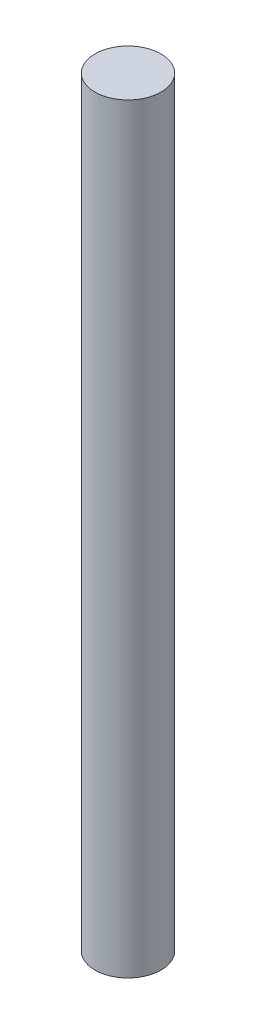
ISO-10303-21;
HEADER;
FILE_DESCRIPTION(('STEP AP214'),'2;1');
FILE_NAME('part.step','',(''),(''),'','','');
FILE_SCHEMA(('AUTOMOTIVE_DESIGN { 1 0 10303 214 1 1 1 1 }'));
ENDSEC;
DATA;
#1=APPLICATION_CONTEXT('core data for automotive mechanical design processes');
#2=APPLICATION_PROTOCOL_DEFINITION('international standard','automotive_design',2000,#1);
#3=PRODUCT_CONTEXT('',#1,'mechanical');
#4=PRODUCT('Part','Part','',(#3));
#5=PRODUCT_RELATED_PRODUCT_CATEGORY('part','',(#4));
#6=PRODUCT_DEFINITION_FORMATION('','',#4);
#7=PRODUCT_DEFINITION_CONTEXT('part definition',#1,'design');
#8=PRODUCT_DEFINITION('design','',#6,#7);
#9=PRODUCT_DEFINITION_SHAPE('','',#8);
#10=(LENGTH_UNIT() NAMED_UNIT(*) SI_UNIT(.MILLI.,.METRE.));
#11=(NAMED_UNIT(*) PLANE_ANGLE_UNIT() SI_UNIT($,.RADIAN.));
#12=(NAMED_UNIT(*) SI_UNIT($,.STERADIAN.) SOLID_ANGLE_UNIT());
#13=UNCERTAINTY_MEASURE_WITH_UNIT(LENGTH_MEASURE(1.E-05),#10,'distance_accuracy_value','');
#14=(GEOMETRIC_REPRESENTATION_CONTEXT(3) GLOBAL_UNCERTAINTY_ASSIGNED_CONTEXT((#13)) GLOBAL_UNIT_ASSIGNED_CONTEXT((#10,
#11,#12)) REPRESENTATION_CONTEXT('',''));
#15=CARTESIAN_POINT('',(0.,0.,0.));
#16=DIRECTION('',(0.,0.,1.));
#17=DIRECTION('',(1.,0.,0.));
#18=AXIS2_PLACEMENT_3D('',#15,#16,#17);
#19=CARTESIAN_POINT('',(0.,92.,0.));
#20=DIRECTION('',(0.,-1.,0.));
#21=DIRECTION('',(0.,0.,-1.));
#22=AXIS2_PLACEMENT_3D('',#19,#20,#21);
#23=CYLINDRICAL_SURFACE('',#22,4.);
#24=CARTESIAN_POINT('',(0.,92.,0.));
#25=DIRECTION('',(0.,1.,0.));
#26=DIRECTION('',(0.,0.,1.));
#27=AXIS2_PLACEMENT_3D('',#24,#25,#26);
#28=CIRCLE('',#27,4.);
#29=CARTESIAN_POINT('',(0.,92.,4.));
#30=VERTEX_POINT('',#29);
#31=EDGE_CURVE('E10',#30,#30,#28,.T.);
#32=ORIENTED_EDGE('',*,*,#31,.F.);
#33=EDGE_LOOP('',(#32));
#34=FACE_BOUND('',#33,.T.);
#35=CARTESIAN_POINT('',(0.,0.,0.));
#36=DIRECTION('',(0.,1.,0.));
#37=DIRECTION('',(0.,0.,1.));
#38=AXIS2_PLACEMENT_3D('',#35,#36,#37);
#39=CIRCLE('',#38,4.);
#40=CARTESIAN_POINT('',(0.,0.,4.));
#41=VERTEX_POINT('',#40);
#42=EDGE_CURVE('E46',#41,#41,#39,.T.);
#43=ORIENTED_EDGE('',*,*,#42,.T.);
#44=EDGE_LOOP('',(#43));
#45=FACE_BOUND('',#44,.T.);
#46=ADVANCED_FACE('F43',(#34,#45),#23,.T.);
#47=CARTESIAN_POINT('',(0.,92.,0.));
#48=DIRECTION('',(0.,1.,0.));
#49=DIRECTION('',(0.,0.,1.));
#50=AXIS2_PLACEMENT_3D('',#47,#48,#49);
#51=PLANE('',#50);
#52=ORIENTED_EDGE('',*,*,#31,.T.);
#53=EDGE_LOOP('',(#52));
#54=FACE_BOUND('',#53,.T.);
#55=ADVANCED_FACE('F60',(#54),#51,.T.);
#56=CARTESIAN_POINT('',(0.,0.,0.));
#57=DIRECTION('',(0.,1.,0.));
#58=DIRECTION('',(0.,0.,1.));
#59=AXIS2_PLACEMENT_3D('',#56,#57,#58);
#60=PLANE('',#59);
#61=ORIENTED_EDGE('',*,*,#42,.F.);
#62=EDGE_LOOP('',(#61));
#63=FACE_BOUND('',#62,.T.);
#64=ADVANCED_FACE('F58',(#63),#60,.F.);
#65=CLOSED_SHELL('',(#46,#55,#64));
#66=MANIFOLD_SOLID_BREP('B2',#65);
#67=ADVANCED_BREP_SHAPE_REPRESENTATION('',(#18,#66),#14);
#68=SHAPE_DEFINITION_REPRESENTATION(#9,#67);
ENDSEC;
END-ISO-10303-21;
